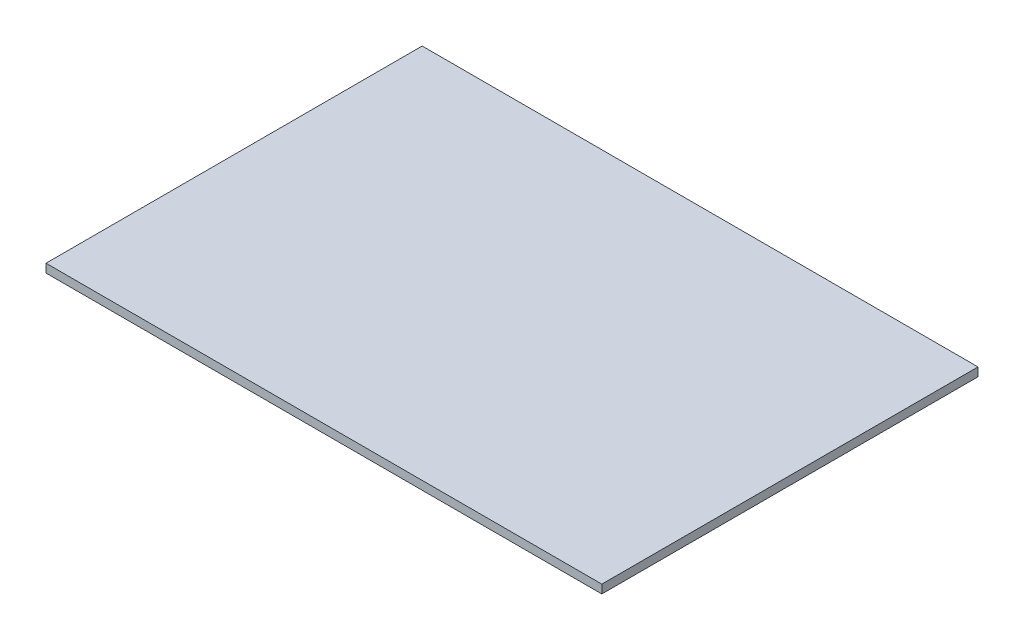
ISO-10303-21;
HEADER;
FILE_DESCRIPTION(('STEP AP214'),'2;1');
FILE_NAME('part.step','',(''),(''),'','','');
FILE_SCHEMA(('AUTOMOTIVE_DESIGN { 1 0 10303 214 1 1 1 1 }'));
ENDSEC;
DATA;
#1=APPLICATION_CONTEXT('core data for automotive mechanical design processes');
#2=APPLICATION_PROTOCOL_DEFINITION('international standard','automotive_design',2000,#1);
#3=PRODUCT_CONTEXT('',#1,'mechanical');
#4=PRODUCT('Part','Part','',(#3));
#5=PRODUCT_RELATED_PRODUCT_CATEGORY('part','',(#4));
#6=PRODUCT_DEFINITION_FORMATION('','',#4);
#7=PRODUCT_DEFINITION_CONTEXT('part definition',#1,'design');
#8=PRODUCT_DEFINITION('design','',#6,#7);
#9=PRODUCT_DEFINITION_SHAPE('','',#8);
#10=(LENGTH_UNIT() NAMED_UNIT(*) SI_UNIT(.MILLI.,.METRE.));
#11=(NAMED_UNIT(*) PLANE_ANGLE_UNIT() SI_UNIT($,.RADIAN.));
#12=(NAMED_UNIT(*) SI_UNIT($,.STERADIAN.) SOLID_ANGLE_UNIT());
#13=UNCERTAINTY_MEASURE_WITH_UNIT(LENGTH_MEASURE(1.E-05),#10,'distance_accuracy_value','');
#14=(GEOMETRIC_REPRESENTATION_CONTEXT(3) GLOBAL_UNCERTAINTY_ASSIGNED_CONTEXT((#13)) GLOBAL_UNIT_ASSIGNED_CONTEXT((#10,
#11,#12)) REPRESENTATION_CONTEXT('',''));
#15=CARTESIAN_POINT('',(0.,0.,0.));
#16=DIRECTION('',(0.,0.,1.));
#17=DIRECTION('',(1.,0.,0.));
#18=AXIS2_PLACEMENT_3D('',#15,#16,#17);
#19=CARTESIAN_POINT('',(-32.968347008989,2.38174550300886,-21.65971565207));
#20=DIRECTION('',(1.,0.,0.));
#21=DIRECTION('',(0.,0.,-1.));
#22=AXIS2_PLACEMENT_3D('',#19,#20,#21);
#23=PLANE('',#22);
#24=DIRECTION('',(0.,0.,1.));
#25=VECTOR('',#24,1.);
#26=CARTESIAN_POINT('',(-32.968347008989,0.,-21.65971565207));
#27=LINE('',#26,#25);
#28=CARTESIAN_POINT('',(-32.968347008989,0.,-21.65971565207));
#29=VERTEX_POINT('',#28);
#30=CARTESIAN_POINT('',(-32.968347008989,0.,83.0311611082278));
#31=VERTEX_POINT('',#30);
#32=EDGE_CURVE('E100',#29,#31,#27,.T.);
#33=ORIENTED_EDGE('',*,*,#32,.T.);
#34=DIRECTION('',(0.,-1.,0.));
#35=VECTOR('',#34,1.);
#36=CARTESIAN_POINT('',(-32.968347008989,2.38174550300886,83.0311611082278));
#37=LINE('',#36,#35);
#38=CARTESIAN_POINT('',(-32.968347008989,2.38174550300886,83.0311611082278));
#39=VERTEX_POINT('',#38);
#40=EDGE_CURVE('E11',#39,#31,#37,.T.);
#41=ORIENTED_EDGE('',*,*,#40,.F.);
#42=DIRECTION('',(0.,0.,1.));
#43=VECTOR('',#42,1.);
#44=CARTESIAN_POINT('',(-32.968347008989,2.38174550300886,-21.65971565207));
#45=LINE('',#44,#43);
#46=CARTESIAN_POINT('',(-32.968347008989,2.38174550300886,-21.65971565207));
#47=VERTEX_POINT('',#46);
#48=EDGE_CURVE('E88',#47,#39,#45,.T.);
#49=ORIENTED_EDGE('',*,*,#48,.F.);
#50=DIRECTION('',(0.,-1.,0.));
#51=VECTOR('',#50,1.);
#52=CARTESIAN_POINT('',(-32.968347008989,2.38174550300886,-21.65971565207));
#53=LINE('',#52,#51);
#54=EDGE_CURVE('E96',#47,#29,#53,.T.);
#55=ORIENTED_EDGE('',*,*,#54,.T.);
#56=EDGE_LOOP('',(#33,#41,#49,#55));
#57=FACE_BOUND('',#56,.T.);
#58=ADVANCED_FACE('F37',(#57),#23,.F.);
#59=CARTESIAN_POINT('',(-32.968347008989,2.38174550300886,83.0311611082278));
#60=DIRECTION('',(0.,0.,-1.));
#61=DIRECTION('',(-1.,0.,0.));
#62=AXIS2_PLACEMENT_3D('',#59,#60,#61);
#63=PLANE('',#62);
#64=DIRECTION('',(1.,0.,0.));
#65=VECTOR('',#64,1.);
#66=CARTESIAN_POINT('',(-32.968347008989,0.,83.0311611082278));
#67=LINE('',#66,#65);
#68=CARTESIAN_POINT('',(121.720883824538,0.,83.0311611082278));
#69=VERTEX_POINT('',#68);
#70=EDGE_CURVE('E92',#31,#69,#67,.T.);
#71=ORIENTED_EDGE('',*,*,#70,.T.);
#72=DIRECTION('',(0.,-1.,0.));
#73=VECTOR('',#72,1.);
#74=CARTESIAN_POINT('',(121.720883824538,2.38174550300886,83.0311611082278));
#75=LINE('',#74,#73);
#76=CARTESIAN_POINT('',(121.720883824538,2.38174550300886,83.0311611082278));
#77=VERTEX_POINT('',#76);
#78=EDGE_CURVE('E45',#77,#69,#75,.T.);
#79=ORIENTED_EDGE('',*,*,#78,.F.);
#80=DIRECTION('',(1.,0.,0.));
#81=VECTOR('',#80,1.);
#82=CARTESIAN_POINT('',(-32.968347008989,2.38174550300886,83.0311611082278));
#83=LINE('',#82,#81);
#84=EDGE_CURVE('E83',#39,#77,#83,.T.);
#85=ORIENTED_EDGE('',*,*,#84,.F.);
#86=ORIENTED_EDGE('',*,*,#40,.T.);
#87=EDGE_LOOP('',(#71,#79,#85,#86));
#88=FACE_BOUND('',#87,.T.);
#89=ADVANCED_FACE('F91',(#88),#63,.F.);
#90=CARTESIAN_POINT('',(121.720883824538,2.38174550300886,-21.65971565207));
#91=DIRECTION('',(-1.,0.,0.));
#92=DIRECTION('',(0.,0.,1.));
#93=AXIS2_PLACEMENT_3D('',#90,#91,#92);
#94=PLANE('',#93);
#95=DIRECTION('',(0.,0.,-1.));
#96=VECTOR('',#95,1.);
#97=CARTESIAN_POINT('',(121.720883824538,0.,-21.65971565207));
#98=LINE('',#97,#96);
#99=CARTESIAN_POINT('',(121.720883824538,0.,-21.65971565207));
#100=VERTEX_POINT('',#99);
#101=EDGE_CURVE('E70',#69,#100,#98,.T.);
#102=ORIENTED_EDGE('',*,*,#101,.T.);
#103=DIRECTION('',(0.,-1.,0.));
#104=VECTOR('',#103,1.);
#105=CARTESIAN_POINT('',(121.720883824538,2.38174550300886,-21.65971565207));
#106=LINE('',#105,#104);
#107=CARTESIAN_POINT('',(121.720883824538,2.38174550300886,-21.65971565207));
#108=VERTEX_POINT('',#107);
#109=EDGE_CURVE('E93',#108,#100,#106,.T.);
#110=ORIENTED_EDGE('',*,*,#109,.F.);
#111=DIRECTION('',(0.,0.,-1.));
#112=VECTOR('',#111,1.);
#113=CARTESIAN_POINT('',(121.720883824538,2.38174550300886,-21.65971565207));
#114=LINE('',#113,#112);
#115=EDGE_CURVE('E86',#77,#108,#114,.T.);
#116=ORIENTED_EDGE('',*,*,#115,.F.);
#117=ORIENTED_EDGE('',*,*,#78,.T.);
#118=EDGE_LOOP('',(#102,#110,#116,#117));
#119=FACE_BOUND('',#118,.T.);
#120=ADVANCED_FACE('F94',(#119),#94,.F.);
#121=CARTESIAN_POINT('',(-32.968347008989,2.38174550300886,-21.65971565207));
#122=DIRECTION('',(0.,0.,1.));
#123=DIRECTION('',(1.,0.,0.));
#124=AXIS2_PLACEMENT_3D('',#121,#122,#123);
#125=PLANE('',#124);
#126=DIRECTION('',(-1.,0.,0.));
#127=VECTOR('',#126,1.);
#128=CARTESIAN_POINT('',(-32.968347008989,0.,-21.65971565207));
#129=LINE('',#128,#127);
#130=EDGE_CURVE('E76',#100,#29,#129,.T.);
#131=ORIENTED_EDGE('',*,*,#130,.T.);
#132=ORIENTED_EDGE('',*,*,#54,.F.);
#133=DIRECTION('',(-1.,0.,0.));
#134=VECTOR('',#133,1.);
#135=CARTESIAN_POINT('',(-32.968347008989,2.38174550300886,-21.65971565207));
#136=LINE('',#135,#134);
#137=EDGE_CURVE('E53',#108,#47,#136,.T.);
#138=ORIENTED_EDGE('',*,*,#137,.F.);
#139=ORIENTED_EDGE('',*,*,#109,.T.);
#140=EDGE_LOOP('',(#131,#132,#138,#139));
#141=FACE_BOUND('',#140,.T.);
#142=ADVANCED_FACE('F107',(#141),#125,.F.);
#143=CARTESIAN_POINT('',(0.,2.38174550300886,0.));
#144=DIRECTION('',(0.,1.,0.));
#145=DIRECTION('',(0.,0.,1.));
#146=AXIS2_PLACEMENT_3D('',#143,#144,#145);
#147=PLANE('',#146);
#148=ORIENTED_EDGE('',*,*,#48,.T.);
#149=ORIENTED_EDGE('',*,*,#84,.T.);
#150=ORIENTED_EDGE('',*,*,#115,.T.);
#151=ORIENTED_EDGE('',*,*,#137,.T.);
#152=EDGE_LOOP('',(#148,#149,#150,#151));
#153=FACE_BOUND('',#152,.T.);
#154=ADVANCED_FACE('F84',(#153),#147,.T.);
#155=CARTESIAN_POINT('',(0.,0.,0.));
#156=DIRECTION('',(0.,1.,0.));
#157=DIRECTION('',(0.,0.,1.));
#158=AXIS2_PLACEMENT_3D('',#155,#156,#157);
#159=PLANE('',#158);
#160=ORIENTED_EDGE('',*,*,#32,.F.);
#161=ORIENTED_EDGE('',*,*,#130,.F.);
#162=ORIENTED_EDGE('',*,*,#101,.F.);
#163=ORIENTED_EDGE('',*,*,#70,.F.);
#164=EDGE_LOOP('',(#160,#161,#162,#163));
#165=FACE_BOUND('',#164,.T.);
#166=ADVANCED_FACE('F110',(#165),#159,.F.);
#167=CLOSED_SHELL('',(#58,#89,#120,#142,#154,#166));
#168=MANIFOLD_SOLID_BREP('B2',#167);
#169=ADVANCED_BREP_SHAPE_REPRESENTATION('',(#18,#168),#14);
#170=SHAPE_DEFINITION_REPRESENTATION(#9,#169);
ENDSEC;
END-ISO-10303-21;
